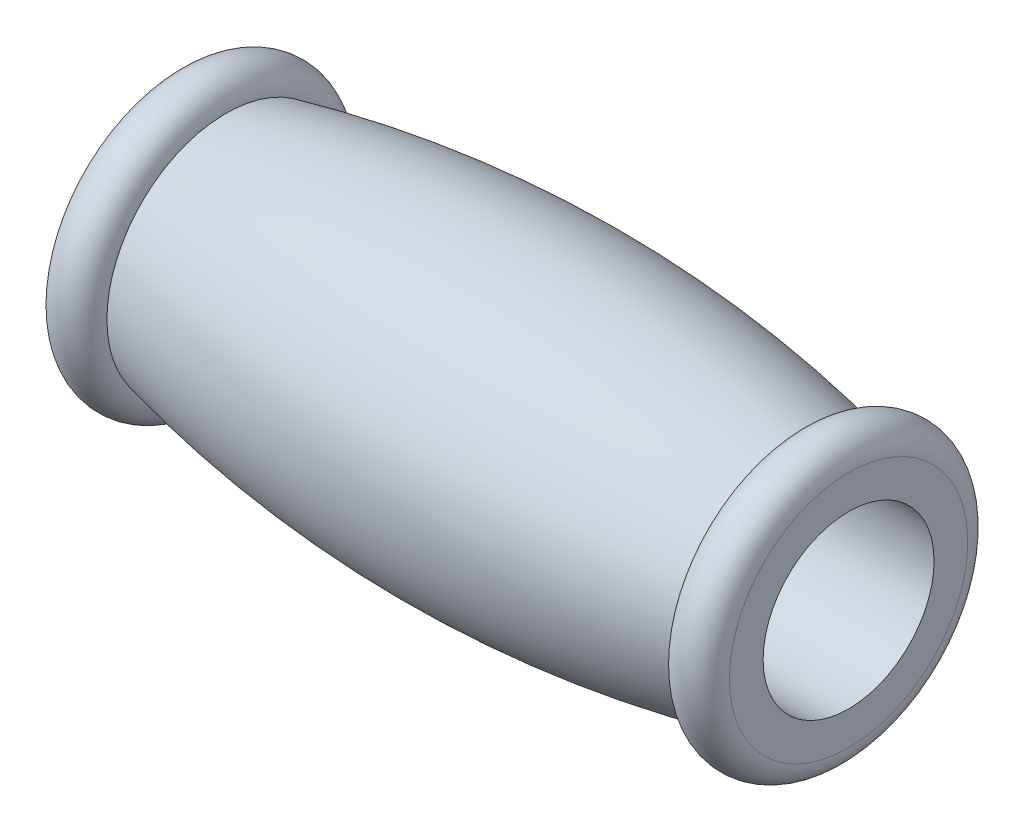
ISO-10303-21;
HEADER;
FILE_DESCRIPTION(('STEP AP214'),'2;1');
FILE_NAME('part.step','',(''),(''),'','','');
FILE_SCHEMA(('AUTOMOTIVE_DESIGN { 1 0 10303 214 1 1 1 1 }'));
ENDSEC;
DATA;
#1=APPLICATION_CONTEXT('core data for automotive mechanical design processes');
#2=APPLICATION_PROTOCOL_DEFINITION('international standard','automotive_design',2000,#1);
#3=PRODUCT_CONTEXT('',#1,'mechanical');
#4=PRODUCT('Part','Part','',(#3));
#5=PRODUCT_RELATED_PRODUCT_CATEGORY('part','',(#4));
#6=PRODUCT_DEFINITION_FORMATION('','',#4);
#7=PRODUCT_DEFINITION_CONTEXT('part definition',#1,'design');
#8=PRODUCT_DEFINITION('design','',#6,#7);
#9=PRODUCT_DEFINITION_SHAPE('','',#8);
#10=(LENGTH_UNIT() NAMED_UNIT(*) SI_UNIT(.MILLI.,.METRE.));
#11=(NAMED_UNIT(*) PLANE_ANGLE_UNIT() SI_UNIT($,.RADIAN.));
#12=(NAMED_UNIT(*) SI_UNIT($,.STERADIAN.) SOLID_ANGLE_UNIT());
#13=UNCERTAINTY_MEASURE_WITH_UNIT(LENGTH_MEASURE(1.E-05),#10,'distance_accuracy_value','');
#14=(GEOMETRIC_REPRESENTATION_CONTEXT(3) GLOBAL_UNCERTAINTY_ASSIGNED_CONTEXT((#13)) GLOBAL_UNIT_ASSIGNED_CONTEXT((#10,
#11,#12)) REPRESENTATION_CONTEXT('',''));
#15=CARTESIAN_POINT('',(0.,0.,0.));
#16=DIRECTION('',(0.,0.,1.));
#17=DIRECTION('',(1.,0.,0.));
#18=AXIS2_PLACEMENT_3D('',#15,#16,#17);
#19=CARTESIAN_POINT('',(-50.,12.7,0.));
#20=DIRECTION('',(1.,0.,0.));
#21=DIRECTION('',(0.,0.,-1.));
#22=AXIS2_PLACEMENT_3D('',#19,#20,#21);
#23=PLANE('',#22);
#24=CARTESIAN_POINT('',(-50.,0.,0.));
#25=DIRECTION('',(-1.,0.,0.));
#26=DIRECTION('',(0.,0.,1.));
#27=AXIS2_PLACEMENT_3D('',#24,#25,#26);
#28=CIRCLE('',#27,12.7);
#29=CARTESIAN_POINT('',(-50.,0.,12.7));
#30=VERTEX_POINT('',#29);
#31=EDGE_CURVE('E10',#30,#30,#28,.T.);
#32=ORIENTED_EDGE('',*,*,#31,.F.);
#33=EDGE_LOOP('',(#32));
#34=FACE_BOUND('',#33,.T.);
#35=CARTESIAN_POINT('',(-50.,0.,0.));
#36=DIRECTION('',(-1.,0.,0.));
#37=DIRECTION('',(0.,0.,1.));
#38=AXIS2_PLACEMENT_3D('',#35,#36,#37);
#39=CIRCLE('',#38,17.7);
#40=CARTESIAN_POINT('',(-50.,0.,17.7));
#41=VERTEX_POINT('',#40);
#42=EDGE_CURVE('E63',#41,#41,#39,.T.);
#43=ORIENTED_EDGE('',*,*,#42,.T.);
#44=EDGE_LOOP('',(#43));
#45=FACE_BOUND('',#44,.T.);
#46=ADVANCED_FACE('F41',(#34,#45),#23,.F.);
#47=CARTESIAN_POINT('',(-100.,0.,0.));
#48=DIRECTION('',(-1.,0.,0.));
#49=DIRECTION('',(0.,0.,1.));
#50=AXIS2_PLACEMENT_3D('',#47,#48,#49);
#51=CYLINDRICAL_SURFACE('',#50,12.7);
#52=CARTESIAN_POINT('',(50.,0.,0.));
#53=DIRECTION('',(-1.,0.,0.));
#54=DIRECTION('',(0.,0.,1.));
#55=AXIS2_PLACEMENT_3D('',#52,#53,#54);
#56=CIRCLE('',#55,12.7);
#57=CARTESIAN_POINT('',(50.,0.,12.7));
#58=VERTEX_POINT('',#57);
#59=EDGE_CURVE('E47',#58,#58,#56,.T.);
#60=ORIENTED_EDGE('',*,*,#59,.F.);
#61=EDGE_LOOP('',(#60));
#62=FACE_BOUND('',#61,.T.);
#63=ORIENTED_EDGE('',*,*,#31,.T.);
#64=EDGE_LOOP('',(#63));
#65=FACE_BOUND('',#64,.T.);
#66=ADVANCED_FACE('F88',(#62,#65),#51,.F.);
#67=CARTESIAN_POINT('',(50.,12.7,0.));
#68=DIRECTION('',(-1.,0.,0.));
#69=DIRECTION('',(0.,0.,1.));
#70=AXIS2_PLACEMENT_3D('',#67,#68,#69);
#71=PLANE('',#70);
#72=CARTESIAN_POINT('',(50.,0.,0.));
#73=DIRECTION('',(-1.,0.,0.));
#74=DIRECTION('',(0.,0.,1.));
#75=AXIS2_PLACEMENT_3D('',#72,#73,#74);
#76=CIRCLE('',#75,17.7);
#77=CARTESIAN_POINT('',(50.,0.,17.7));
#78=VERTEX_POINT('',#77);
#79=EDGE_CURVE('E51',#78,#78,#76,.T.);
#80=ORIENTED_EDGE('',*,*,#79,.F.);
#81=EDGE_LOOP('',(#80));
#82=FACE_BOUND('',#81,.T.);
#83=ORIENTED_EDGE('',*,*,#59,.T.);
#84=EDGE_LOOP('',(#83));
#85=FACE_BOUND('',#84,.T.);
#86=ADVANCED_FACE('F83',(#82,#85),#71,.F.);
#87=CARTESIAN_POINT('',(46.25,0.,0.));
#88=DIRECTION('',(-1.,0.,0.));
#89=DIRECTION('',(0.,0.,1.));
#90=AXIS2_PLACEMENT_3D('',#87,#88,#89);
#91=TOROIDAL_SURFACE('',#90,17.7,3.75);
#92=CARTESIAN_POINT('',(42.5,0.,0.));
#93=DIRECTION('',(-1.,0.,0.));
#94=DIRECTION('',(0.,0.,1.));
#95=AXIS2_PLACEMENT_3D('',#92,#93,#94);
#96=CIRCLE('',#95,17.7);
#97=CARTESIAN_POINT('',(42.5,0.,17.7));
#98=VERTEX_POINT('',#97);
#99=EDGE_CURVE('E55',#98,#98,#96,.T.);
#100=ORIENTED_EDGE('',*,*,#99,.F.);
#101=EDGE_LOOP('',(#100));
#102=FACE_BOUND('',#101,.T.);
#103=ORIENTED_EDGE('',*,*,#79,.T.);
#104=EDGE_LOOP('',(#103));
#105=FACE_BOUND('',#104,.T.);
#106=ADVANCED_FACE('F77',(#102,#105),#91,.T.);
#107=CARTESIAN_POINT('',(0.,0.,0.));
#108=DIRECTION('',(-1.,0.,0.));
#109=DIRECTION('',(0.,0.,1.));
#110=AXIS2_PLACEMENT_3D('',#107,#108,#109);
#111=DEGENERATE_TOROIDAL_SURFACE('',#110,166.894329455929,189.423642841341,.F.);
#112=CARTESIAN_POINT('',(-42.5,0.,0.));
#113=DIRECTION('',(-1.,0.,0.));
#114=DIRECTION('',(0.,0.,1.));
#115=AXIS2_PLACEMENT_3D('',#112,#113,#114);
#116=CIRCLE('',#115,17.7);
#117=CARTESIAN_POINT('',(-42.5,0.,17.7));
#118=VERTEX_POINT('',#117);
#119=EDGE_CURVE('E60',#118,#118,#116,.T.);
#120=ORIENTED_EDGE('',*,*,#119,.F.);
#121=EDGE_LOOP('',(#120));
#122=FACE_BOUND('',#121,.T.);
#123=ORIENTED_EDGE('',*,*,#99,.T.);
#124=EDGE_LOOP('',(#123));
#125=FACE_BOUND('',#124,.T.);
#126=ADVANCED_FACE('F71',(#122,#125),#111,.F.);
#127=CARTESIAN_POINT('',(-46.25,0.,0.));
#128=DIRECTION('',(-1.,0.,0.));
#129=DIRECTION('',(0.,0.,1.));
#130=AXIS2_PLACEMENT_3D('',#127,#128,#129);
#131=TOROIDAL_SURFACE('',#130,17.7,3.75);
#132=ORIENTED_EDGE('',*,*,#42,.F.);
#133=EDGE_LOOP('',(#132));
#134=FACE_BOUND('',#133,.T.);
#135=ORIENTED_EDGE('',*,*,#119,.T.);
#136=EDGE_LOOP('',(#135));
#137=FACE_BOUND('',#136,.T.);
#138=ADVANCED_FACE('F68',(#134,#137),#131,.T.);
#139=CLOSED_SHELL('',(#46,#66,#86,#106,#126,#138));
#140=MANIFOLD_SOLID_BREP('B2',#139);
#141=ADVANCED_BREP_SHAPE_REPRESENTATION('',(#18,#140),#14);
#142=SHAPE_DEFINITION_REPRESENTATION(#9,#141);
ENDSEC;
END-ISO-10303-21;
